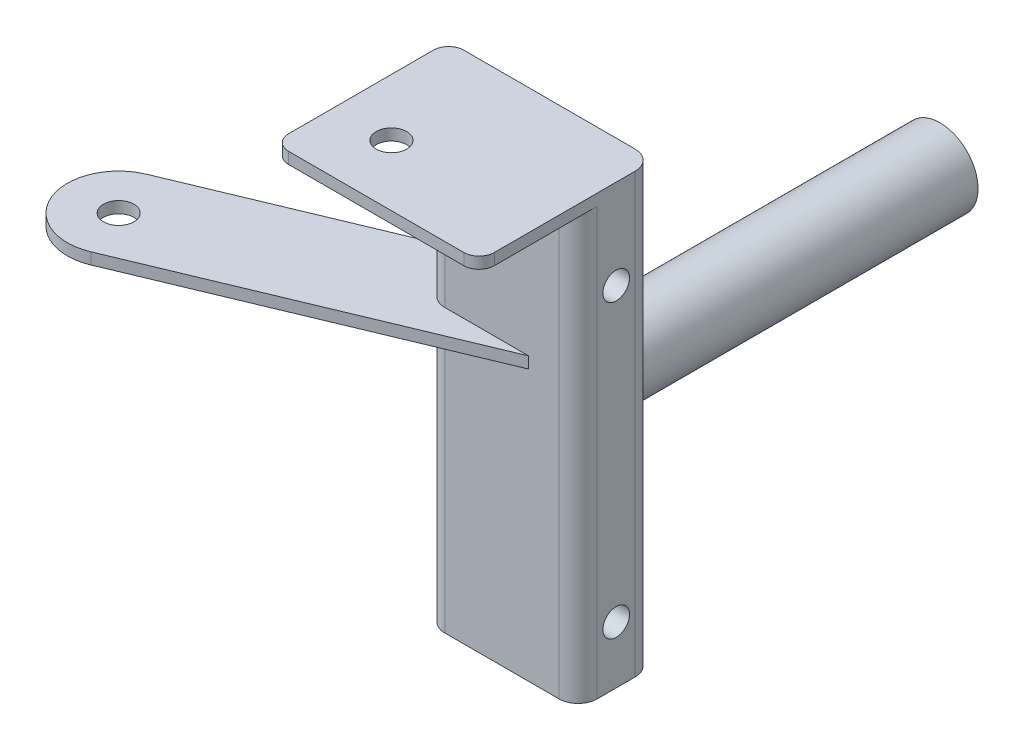
ISO-10303-21;
HEADER;
FILE_DESCRIPTION(('STEP AP214'),'2;1');
FILE_NAME('part.step','',(''),(''),'','','');
FILE_SCHEMA(('AUTOMOTIVE_DESIGN { 1 0 10303 214 1 1 1 1 }'));
ENDSEC;
DATA;
#1=APPLICATION_CONTEXT('core data for automotive mechanical design processes');
#2=APPLICATION_PROTOCOL_DEFINITION('international standard','automotive_design',2000,#1);
#3=PRODUCT_CONTEXT('',#1,'mechanical');
#4=PRODUCT('Part','Part','',(#3));
#5=PRODUCT_RELATED_PRODUCT_CATEGORY('part','',(#4));
#6=PRODUCT_DEFINITION_FORMATION('','',#4);
#7=PRODUCT_DEFINITION_CONTEXT('part definition',#1,'design');
#8=PRODUCT_DEFINITION('design','',#6,#7);
#9=PRODUCT_DEFINITION_SHAPE('','',#8);
#10=(LENGTH_UNIT() NAMED_UNIT(*) SI_UNIT(.MILLI.,.METRE.));
#11=(NAMED_UNIT(*) PLANE_ANGLE_UNIT() SI_UNIT($,.RADIAN.));
#12=(NAMED_UNIT(*) SI_UNIT($,.STERADIAN.) SOLID_ANGLE_UNIT());
#13=UNCERTAINTY_MEASURE_WITH_UNIT(LENGTH_MEASURE(1.E-05),#10,'distance_accuracy_value','');
#14=(GEOMETRIC_REPRESENTATION_CONTEXT(3) GLOBAL_UNCERTAINTY_ASSIGNED_CONTEXT((#13)) GLOBAL_UNIT_ASSIGNED_CONTEXT((#10,
#11,#12)) REPRESENTATION_CONTEXT('',''));
#15=CARTESIAN_POINT('',(0.,0.,0.));
#16=DIRECTION('',(0.,0.,1.));
#17=DIRECTION('',(1.,0.,0.));
#18=AXIS2_PLACEMENT_3D('',#15,#16,#17);
#19=CARTESIAN_POINT('',(-40.,115.,0.));
#20=DIRECTION('',(1.,0.,0.));
#21=DIRECTION('',(0.,0.,1.));
#22=AXIS2_PLACEMENT_3D('',#19,#20,#21);
#23=PLANE('',#22);
#24=DIRECTION('',(0.,0.,-1.));
#25=VECTOR('',#24,1.);
#26=CARTESIAN_POINT('',(-40.,0.,0.));
#27=LINE('',#26,#25);
#28=CARTESIAN_POINT('',(-40.,0.,-5.));
#29=VERTEX_POINT('',#28);
#30=CARTESIAN_POINT('',(-40.,0.,-18.));
#31=VERTEX_POINT('',#30);
#32=EDGE_CURVE('E302',#29,#31,#27,.T.);
#33=ORIENTED_EDGE('',*,*,#32,.F.);
#34=DIRECTION('',(0.,-1.,0.));
#35=VECTOR('',#34,1.);
#36=CARTESIAN_POINT('',(-40.,115.,-5.));
#37=LINE('',#36,#35);
#38=CARTESIAN_POINT('',(-40.,71.,-5.));
#39=VERTEX_POINT('',#38);
#40=EDGE_CURVE('E337',#39,#29,#37,.T.);
#41=ORIENTED_EDGE('',*,*,#40,.F.);
#42=DIRECTION('',(0.,0.,1.));
#43=VECTOR('',#42,1.);
#44=CARTESIAN_POINT('',(-40.,71.,0.));
#45=LINE('',#44,#43);
#46=CARTESIAN_POINT('',(-40.,71.,-18.));
#47=VERTEX_POINT('',#46);
#48=EDGE_CURVE('E498',#47,#39,#45,.T.);
#49=ORIENTED_EDGE('',*,*,#48,.F.);
#50=DIRECTION('',(0.,-1.,0.));
#51=VECTOR('',#50,1.);
#52=CARTESIAN_POINT('',(-40.,115.,-18.));
#53=LINE('',#52,#51);
#54=EDGE_CURVE('E202',#31,#47,#53,.F.);
#55=ORIENTED_EDGE('',*,*,#54,.F.);
#56=EDGE_LOOP('',(#33,#41,#49,#55));
#57=FACE_BOUND('',#56,.T.);
#58=ADVANCED_FACE('F51',(#57),#23,.F.);
#59=CARTESIAN_POINT('',(0.,115.,0.));
#60=DIRECTION('',(0.,0.,-1.));
#61=DIRECTION('',(1.,0.,0.));
#62=AXIS2_PLACEMENT_3D('',#59,#60,#61);
#63=PLANE('',#62);
#64=DIRECTION('',(-1.,0.,0.));
#65=VECTOR('',#64,1.);
#66=CARTESIAN_POINT('',(0.,0.,0.));
#67=LINE('',#66,#65);
#68=CARTESIAN_POINT('',(-5.,0.,0.));
#69=VERTEX_POINT('',#68);
#70=CARTESIAN_POINT('',(-35.,0.,0.));
#71=VERTEX_POINT('',#70);
#72=EDGE_CURVE('E299',#69,#71,#67,.T.);
#73=ORIENTED_EDGE('',*,*,#72,.F.);
#74=DIRECTION('',(0.,-1.,0.));
#75=VECTOR('',#74,1.);
#76=CARTESIAN_POINT('',(-5.,115.,0.));
#77=LINE('',#76,#75);
#78=CARTESIAN_POINT('',(-5.,112.,0.));
#79=VERTEX_POINT('',#78);
#80=EDGE_CURVE('E327',#79,#69,#77,.T.);
#81=ORIENTED_EDGE('',*,*,#80,.F.);
#82=DIRECTION('',(-1.,0.,0.));
#83=VECTOR('',#82,1.);
#84=CARTESIAN_POINT('',(0.,112.,0.));
#85=LINE('',#84,#83);
#86=CARTESIAN_POINT('',(-35.,112.,0.));
#87=VERTEX_POINT('',#86);
#88=EDGE_CURVE('E272',#79,#87,#85,.T.);
#89=ORIENTED_EDGE('',*,*,#88,.T.);
#90=DIRECTION('',(0.,-1.,0.));
#91=VECTOR('',#90,1.);
#92=CARTESIAN_POINT('',(-35.,115.,0.));
#93=LINE('',#92,#91);
#94=CARTESIAN_POINT('',(-35.,74.,0.));
#95=VERTEX_POINT('',#94);
#96=EDGE_CURVE('E321',#95,#87,#93,.F.);
#97=ORIENTED_EDGE('',*,*,#96,.F.);
#98=DIRECTION('',(1.,0.,0.));
#99=VECTOR('',#98,1.);
#100=CARTESIAN_POINT('',(0.,74.,0.));
#101=LINE('',#100,#99);
#102=CARTESIAN_POINT('',(-13.,74.,0.));
#103=VERTEX_POINT('',#102);
#104=EDGE_CURVE('E233',#95,#103,#101,.T.);
#105=ORIENTED_EDGE('',*,*,#104,.T.);
#106=DIRECTION('',(0.,1.,0.));
#107=VECTOR('',#106,1.);
#108=CARTESIAN_POINT('',(-13.,71.,0.));
#109=LINE('',#108,#107);
#110=CARTESIAN_POINT('',(-13.,71.,0.));
#111=VERTEX_POINT('',#110);
#112=EDGE_CURVE('E207',#111,#103,#109,.T.);
#113=ORIENTED_EDGE('',*,*,#112,.F.);
#114=DIRECTION('',(1.,0.,0.));
#115=VECTOR('',#114,1.);
#116=CARTESIAN_POINT('',(0.,71.,0.));
#117=LINE('',#116,#115);
#118=CARTESIAN_POINT('',(-35.,71.,0.));
#119=VERTEX_POINT('',#118);
#120=EDGE_CURVE('E501',#119,#111,#117,.T.);
#121=ORIENTED_EDGE('',*,*,#120,.F.);
#122=DIRECTION('',(0.,-1.,0.));
#123=VECTOR('',#122,1.);
#124=CARTESIAN_POINT('',(-35.,115.,0.));
#125=LINE('',#124,#123);
#126=EDGE_CURVE('E342',#71,#119,#125,.F.);
#127=ORIENTED_EDGE('',*,*,#126,.F.);
#128=EDGE_LOOP('',(#73,#81,#89,#97,#105,#113,#121,#127));
#129=FACE_BOUND('',#128,.T.);
#130=ADVANCED_FACE('F436',(#129),#63,.F.);
#131=DIRECTION('',(0.,0.,1.));
#132=VECTOR('',#131,1.);
#133=CARTESIAN_POINT('',(-40.,74.,0.));
#134=LINE('',#133,#132);
#135=CARTESIAN_POINT('',(-40.,74.,-18.));
#136=VERTEX_POINT('',#135);
#137=CARTESIAN_POINT('',(-40.,74.,-5.));
#138=VERTEX_POINT('',#137);
#139=EDGE_CURVE('E219',#136,#138,#134,.T.);
#140=ORIENTED_EDGE('',*,*,#139,.T.);
#141=DIRECTION('',(0.,-1.,0.));
#142=VECTOR('',#141,1.);
#143=CARTESIAN_POINT('',(-40.,115.,-5.));
#144=LINE('',#143,#142);
#145=CARTESIAN_POINT('',(-40.,112.,-5.));
#146=VERTEX_POINT('',#145);
#147=EDGE_CURVE('E319',#146,#138,#144,.T.);
#148=ORIENTED_EDGE('',*,*,#147,.F.);
#149=DIRECTION('',(0.,0.,-1.));
#150=VECTOR('',#149,1.);
#151=CARTESIAN_POINT('',(-40.,112.,0.));
#152=LINE('',#151,#150);
#153=CARTESIAN_POINT('',(-40.,112.,-18.));
#154=VERTEX_POINT('',#153);
#155=EDGE_CURVE('E226',#146,#154,#152,.T.);
#156=ORIENTED_EDGE('',*,*,#155,.T.);
#157=DIRECTION('',(0.,-1.,0.));
#158=VECTOR('',#157,1.);
#159=CARTESIAN_POINT('',(-40.,115.,-18.));
#160=LINE('',#159,#158);
#161=EDGE_CURVE('E199',#136,#154,#160,.F.);
#162=ORIENTED_EDGE('',*,*,#161,.F.);
#163=EDGE_LOOP('',(#140,#148,#156,#162));
#164=FACE_BOUND('',#163,.T.);
#165=ADVANCED_FACE('F223',(#164),#23,.F.);
#166=CARTESIAN_POINT('',(0.,115.,0.));
#167=DIRECTION('',(-1.,0.,0.));
#168=DIRECTION('',(0.,0.,-1.));
#169=AXIS2_PLACEMENT_3D('',#166,#167,#168);
#170=PLANE('',#169);
#171=CARTESIAN_POINT('',(0.,91.5,-10.));
#172=DIRECTION('',(-1.,0.,0.));
#173=DIRECTION('',(0.,0.,1.));
#174=AXIS2_PLACEMENT_3D('',#171,#172,#173);
#175=CIRCLE('',#174,3.5);
#176=CARTESIAN_POINT('',(0.,91.5,-6.50000000000001));
#177=VERTEX_POINT('',#176);
#178=EDGE_CURVE('E749',#177,#177,#175,.T.);
#179=ORIENTED_EDGE('',*,*,#178,.T.);
#180=EDGE_LOOP('',(#179));
#181=FACE_BOUND('',#180,.T.);
#182=CARTESIAN_POINT('',(0.,15.,-10.));
#183=DIRECTION('',(-1.,0.,0.));
#184=DIRECTION('',(0.,0.,1.));
#185=AXIS2_PLACEMENT_3D('',#182,#183,#184);
#186=CIRCLE('',#185,3.5);
#187=CARTESIAN_POINT('',(0.,15.,-6.5));
#188=VERTEX_POINT('',#187);
#189=EDGE_CURVE('E756',#188,#188,#186,.T.);
#190=ORIENTED_EDGE('',*,*,#189,.T.);
#191=EDGE_LOOP('',(#190));
#192=FACE_BOUND('',#191,.T.);
#193=DIRECTION('',(0.,0.,1.));
#194=VECTOR('',#193,1.);
#195=CARTESIAN_POINT('',(0.,112.,0.));
#196=LINE('',#195,#194);
#197=CARTESIAN_POINT('',(0.,112.,-5.));
#198=VERTEX_POINT('',#197);
#199=CARTESIAN_POINT('',(0.,112.,22.));
#200=VERTEX_POINT('',#199);
#201=EDGE_CURVE('E275',#198,#200,#196,.T.);
#202=ORIENTED_EDGE('',*,*,#201,.F.);
#203=DIRECTION('',(0.,-1.,0.));
#204=VECTOR('',#203,1.);
#205=CARTESIAN_POINT('',(0.,115.,-5.));
#206=LINE('',#205,#204);
#207=CARTESIAN_POINT('',(0.,0.,-5.));
#208=VERTEX_POINT('',#207);
#209=EDGE_CURVE('E332',#208,#198,#206,.F.);
#210=ORIENTED_EDGE('',*,*,#209,.F.);
#211=DIRECTION('',(0.,0.,1.));
#212=VECTOR('',#211,1.);
#213=CARTESIAN_POINT('',(0.,0.,0.));
#214=LINE('',#213,#212);
#215=CARTESIAN_POINT('',(0.,0.,-15.));
#216=VERTEX_POINT('',#215);
#217=EDGE_CURVE('E281',#216,#208,#214,.T.);
#218=ORIENTED_EDGE('',*,*,#217,.F.);
#219=DIRECTION('',(0.,-1.,0.));
#220=VECTOR('',#219,1.);
#221=CARTESIAN_POINT('',(0.,115.,-15.));
#222=LINE('',#221,#220);
#223=CARTESIAN_POINT('',(0.,115.,-15.));
#224=VERTEX_POINT('',#223);
#225=EDGE_CURVE('E309',#224,#216,#222,.T.);
#226=ORIENTED_EDGE('',*,*,#225,.F.);
#227=DIRECTION('',(0.,0.,1.));
#228=VECTOR('',#227,1.);
#229=CARTESIAN_POINT('',(0.,115.,0.));
#230=LINE('',#229,#228);
#231=CARTESIAN_POINT('',(0.,115.,22.));
#232=VERTEX_POINT('',#231);
#233=EDGE_CURVE('E289',#224,#232,#230,.T.);
#234=ORIENTED_EDGE('',*,*,#233,.T.);
#235=DIRECTION('',(0.,1.,0.));
#236=VECTOR('',#235,1.);
#237=CARTESIAN_POINT('',(0.,115.,22.));
#238=LINE('',#237,#236);
#239=EDGE_CURVE('E11',#200,#232,#238,.T.);
#240=ORIENTED_EDGE('',*,*,#239,.F.);
#241=EDGE_LOOP('',(#202,#210,#218,#226,#234,#240));
#242=FACE_BOUND('',#241,.T.);
#243=ADVANCED_FACE('F415',(#181,#192,#242),#170,.F.);
#244=CARTESIAN_POINT('',(0.,115.,-20.));
#245=DIRECTION('',(0.,0.,1.));
#246=DIRECTION('',(-1.,0.,0.));
#247=AXIS2_PLACEMENT_3D('',#244,#245,#246);
#248=PLANE('',#247);
#249=CARTESIAN_POINT('',(-20.,56.,-20.));
#250=DIRECTION('',(0.,0.,-1.));
#251=DIRECTION('',(-1.,0.,0.));
#252=AXIS2_PLACEMENT_3D('',#249,#250,#251);
#253=CIRCLE('',#252,10.);
#254=CARTESIAN_POINT('',(-30.,56.,-20.));
#255=VERTEX_POINT('',#254);
#256=EDGE_CURVE('E254',#255,#255,#253,.T.);
#257=ORIENTED_EDGE('',*,*,#256,.F.);
#258=EDGE_LOOP('',(#257));
#259=FACE_BOUND('',#258,.T.);
#260=DIRECTION('',(1.,0.,0.));
#261=VECTOR('',#260,1.);
#262=CARTESIAN_POINT('',(0.,115.,-20.));
#263=LINE('',#262,#261);
#264=CARTESIAN_POINT('',(-50.,115.,-20.));
#265=VERTEX_POINT('',#264);
#266=CARTESIAN_POINT('',(-5.,115.,-20.));
#267=VERTEX_POINT('',#266);
#268=EDGE_CURVE('E292',#265,#267,#263,.T.);
#269=ORIENTED_EDGE('',*,*,#268,.T.);
#270=DIRECTION('',(0.,-1.,0.));
#271=VECTOR('',#270,1.);
#272=CARTESIAN_POINT('',(-5.,115.,-20.));
#273=LINE('',#272,#271);
#274=CARTESIAN_POINT('',(-5.,0.,-20.));
#275=VERTEX_POINT('',#274);
#276=EDGE_CURVE('E314',#275,#267,#273,.F.);
#277=ORIENTED_EDGE('',*,*,#276,.F.);
#278=DIRECTION('',(1.,0.,0.));
#279=VECTOR('',#278,1.);
#280=CARTESIAN_POINT('',(0.,0.,-20.));
#281=LINE('',#280,#279);
#282=CARTESIAN_POINT('',(-38.,0.,-20.));
#283=VERTEX_POINT('',#282);
#284=EDGE_CURVE('E293',#283,#275,#281,.T.);
#285=ORIENTED_EDGE('',*,*,#284,.F.);
#286=DIRECTION('',(0.,-1.,0.));
#287=VECTOR('',#286,1.);
#288=CARTESIAN_POINT('',(-38.,115.,-20.));
#289=LINE('',#288,#287);
#290=CARTESIAN_POINT('',(-38.,112.,-20.));
#291=VERTEX_POINT('',#290);
#292=EDGE_CURVE('E361',#291,#283,#289,.T.);
#293=ORIENTED_EDGE('',*,*,#292,.F.);
#294=DIRECTION('',(-1.,0.,0.));
#295=VECTOR('',#294,1.);
#296=CARTESIAN_POINT('',(0.,112.,-20.));
#297=LINE('',#296,#295);
#298=CARTESIAN_POINT('',(-50.,112.,-20.));
#299=VERTEX_POINT('',#298);
#300=EDGE_CURVE('E268',#291,#299,#297,.T.);
#301=ORIENTED_EDGE('',*,*,#300,.T.);
#302=DIRECTION('',(0.,1.,0.));
#303=VECTOR('',#302,1.);
#304=CARTESIAN_POINT('',(-50.,115.,-20.));
#305=LINE('',#304,#303);
#306=EDGE_CURVE('E383',#265,#299,#305,.F.);
#307=ORIENTED_EDGE('',*,*,#306,.F.);
#308=EDGE_LOOP('',(#269,#277,#285,#293,#301,#307));
#309=FACE_BOUND('',#308,.T.);
#310=ADVANCED_FACE('F423',(#259,#309),#248,.F.);
#311=CARTESIAN_POINT('',(0.,115.,0.));
#312=DIRECTION('',(0.,-1.,0.));
#313=DIRECTION('',(0.,0.,-1.));
#314=AXIS2_PLACEMENT_3D('',#311,#312,#313);
#315=PLANE('',#314);
#316=DIRECTION('',(0.,0.,1.));
#317=VECTOR('',#316,1.);
#318=CARTESIAN_POINT('',(-54.,115.,0.));
#319=LINE('',#318,#317);
#320=CARTESIAN_POINT('',(-54.,115.,-16.));
#321=VERTEX_POINT('',#320);
#322=CARTESIAN_POINT('',(-54.,115.,22.));
#323=VERTEX_POINT('',#322);
#324=EDGE_CURVE('E284',#321,#323,#319,.T.);
#325=ORIENTED_EDGE('',*,*,#324,.T.);
#326=CARTESIAN_POINT('',(-50.,115.,22.));
#327=DIRECTION('',(0.,1.,0.));
#328=DIRECTION('',(0.,0.,-1.));
#329=AXIS2_PLACEMENT_3D('',#326,#327,#328);
#330=CIRCLE('',#329,4.);
#331=CARTESIAN_POINT('',(-50.,115.,26.));
#332=VERTEX_POINT('',#331);
#333=EDGE_CURVE('E378',#332,#323,#330,.F.);
#334=ORIENTED_EDGE('',*,*,#333,.F.);
#335=DIRECTION('',(-1.,0.,0.));
#336=VECTOR('',#335,1.);
#337=CARTESIAN_POINT('',(0.,115.,26.));
#338=LINE('',#337,#336);
#339=CARTESIAN_POINT('',(-4.,115.,26.));
#340=VERTEX_POINT('',#339);
#341=EDGE_CURVE('E265',#340,#332,#338,.T.);
#342=ORIENTED_EDGE('',*,*,#341,.F.);
#343=CARTESIAN_POINT('',(-4.,115.,22.));
#344=DIRECTION('',(0.,1.,0.));
#345=DIRECTION('',(0.,0.,-1.));
#346=AXIS2_PLACEMENT_3D('',#343,#344,#345);
#347=CIRCLE('',#346,4.);
#348=EDGE_CURVE('E375',#232,#340,#347,.F.);
#349=ORIENTED_EDGE('',*,*,#348,.F.);
#350=ORIENTED_EDGE('',*,*,#233,.F.);
#351=CARTESIAN_POINT('',(-5.,115.,-15.));
#352=DIRECTION('',(0.,1.,0.));
#353=DIRECTION('',(0.,0.,-1.));
#354=AXIS2_PLACEMENT_3D('',#351,#352,#353);
#355=CIRCLE('',#354,5.);
#356=EDGE_CURVE('E317',#267,#224,#355,.F.);
#357=ORIENTED_EDGE('',*,*,#356,.F.);
#358=ORIENTED_EDGE('',*,*,#268,.F.);
#359=CARTESIAN_POINT('',(-50.,115.,-16.));
#360=DIRECTION('',(0.,1.,0.));
#361=DIRECTION('',(0.,0.,-1.));
#362=AXIS2_PLACEMENT_3D('',#359,#360,#361);
#363=CIRCLE('',#362,4.);
#364=EDGE_CURVE('E381',#321,#265,#363,.F.);
#365=ORIENTED_EDGE('',*,*,#364,.F.);
#366=EDGE_LOOP('',(#325,#334,#342,#349,#350,#357,#358,#365));
#367=FACE_BOUND('',#366,.T.);
#368=CARTESIAN_POINT('',(-39.,115.,10.));
#369=DIRECTION('',(0.,-1.,0.));
#370=DIRECTION('',(0.,0.,1.));
#371=AXIS2_PLACEMENT_3D('',#368,#369,#370);
#372=CIRCLE('',#371,4.00000000000001);
#373=CARTESIAN_POINT('',(-39.,115.,14.));
#374=VERTEX_POINT('',#373);
#375=EDGE_CURVE('E258',#374,#374,#372,.T.);
#376=ORIENTED_EDGE('',*,*,#375,.T.);
#377=EDGE_LOOP('',(#376));
#378=FACE_BOUND('',#377,.T.);
#379=ADVANCED_FACE('F398',(#367,#378),#315,.F.);
#380=CARTESIAN_POINT('',(0.,0.,0.));
#381=DIRECTION('',(0.,-1.,0.));
#382=DIRECTION('',(0.,0.,-1.));
#383=AXIS2_PLACEMENT_3D('',#380,#381,#382);
#384=PLANE('',#383);
#385=CARTESIAN_POINT('',(-20.,0.,-10.));
#386=DIRECTION('',(0.,1.,0.));
#387=DIRECTION('',(0.,0.,-1.));
#388=AXIS2_PLACEMENT_3D('',#385,#386,#387);
#389=CIRCLE('',#388,4.);
#390=CARTESIAN_POINT('',(-20.,0.,-14.));
#391=VERTEX_POINT('',#390);
#392=EDGE_CURVE('E206',#391,#391,#389,.T.);
#393=ORIENTED_EDGE('',*,*,#392,.T.);
#394=EDGE_LOOP('',(#393));
#395=FACE_BOUND('',#394,.T.);
#396=ORIENTED_EDGE('',*,*,#284,.T.);
#397=CARTESIAN_POINT('',(-5.,0.,-15.));
#398=DIRECTION('',(0.,1.,0.));
#399=DIRECTION('',(0.,0.,-1.));
#400=AXIS2_PLACEMENT_3D('',#397,#398,#399);
#401=CIRCLE('',#400,5.);
#402=EDGE_CURVE('E312',#216,#275,#401,.T.);
#403=ORIENTED_EDGE('',*,*,#402,.F.);
#404=ORIENTED_EDGE('',*,*,#217,.T.);
#405=CARTESIAN_POINT('',(-5.,0.,-5.));
#406=DIRECTION('',(0.,1.,0.));
#407=DIRECTION('',(0.,0.,-1.));
#408=AXIS2_PLACEMENT_3D('',#405,#406,#407);
#409=CIRCLE('',#408,5.);
#410=EDGE_CURVE('E330',#69,#208,#409,.T.);
#411=ORIENTED_EDGE('',*,*,#410,.F.);
#412=ORIENTED_EDGE('',*,*,#72,.T.);
#413=CARTESIAN_POINT('',(-35.,0.,-5.));
#414=DIRECTION('',(0.,1.,0.));
#415=DIRECTION('',(0.,0.,-1.));
#416=AXIS2_PLACEMENT_3D('',#413,#414,#415);
#417=CIRCLE('',#416,5.);
#418=EDGE_CURVE('E340',#29,#71,#417,.T.);
#419=ORIENTED_EDGE('',*,*,#418,.F.);
#420=ORIENTED_EDGE('',*,*,#32,.T.);
#421=CARTESIAN_POINT('',(-38.,0.,-18.));
#422=DIRECTION('',(0.,1.,0.));
#423=DIRECTION('',(0.,0.,-1.));
#424=AXIS2_PLACEMENT_3D('',#421,#422,#423);
#425=CIRCLE('',#424,2.);
#426=EDGE_CURVE('E227',#283,#31,#425,.T.);
#427=ORIENTED_EDGE('',*,*,#426,.F.);
#428=EDGE_LOOP('',(#396,#403,#404,#411,#412,#419,#420,#427));
#429=FACE_BOUND('',#428,.T.);
#430=ADVANCED_FACE('F495',(#395,#429),#384,.T.);
#431=CARTESIAN_POINT('',(-54.,112.,0.));
#432=DIRECTION('',(1.,0.,0.));
#433=DIRECTION('',(0.,0.,1.));
#434=AXIS2_PLACEMENT_3D('',#431,#432,#433);
#435=PLANE('',#434);
#436=DIRECTION('',(0.,0.,1.));
#437=VECTOR('',#436,1.);
#438=CARTESIAN_POINT('',(-54.,112.,0.));
#439=LINE('',#438,#437);
#440=CARTESIAN_POINT('',(-54.,112.,-16.));
#441=VERTEX_POINT('',#440);
#442=CARTESIAN_POINT('',(-54.,112.,22.));
#443=VERTEX_POINT('',#442);
#444=EDGE_CURVE('E264',#441,#443,#439,.T.);
#445=ORIENTED_EDGE('',*,*,#444,.T.);
#446=DIRECTION('',(0.,1.,0.));
#447=VECTOR('',#446,1.);
#448=CARTESIAN_POINT('',(-54.,112.,22.));
#449=LINE('',#448,#447);
#450=EDGE_CURVE('E371',#323,#443,#449,.F.);
#451=ORIENTED_EDGE('',*,*,#450,.F.);
#452=ORIENTED_EDGE('',*,*,#324,.F.);
#453=DIRECTION('',(0.,1.,0.));
#454=VECTOR('',#453,1.);
#455=CARTESIAN_POINT('',(-54.,112.,-16.));
#456=LINE('',#455,#454);
#457=EDGE_CURVE('E373',#441,#321,#456,.T.);
#458=ORIENTED_EDGE('',*,*,#457,.F.);
#459=EDGE_LOOP('',(#445,#451,#452,#458));
#460=FACE_BOUND('',#459,.T.);
#461=ADVANCED_FACE('F405',(#460),#435,.F.);
#462=CARTESIAN_POINT('',(0.,112.,26.));
#463=DIRECTION('',(0.,0.,1.));
#464=DIRECTION('',(-1.,0.,0.));
#465=AXIS2_PLACEMENT_3D('',#462,#463,#464);
#466=PLANE('',#465);
#467=DIRECTION('',(-1.,0.,0.));
#468=VECTOR('',#467,1.);
#469=CARTESIAN_POINT('',(0.,112.,26.));
#470=LINE('',#469,#468);
#471=CARTESIAN_POINT('',(-4.,112.,26.));
#472=VERTEX_POINT('',#471);
#473=CARTESIAN_POINT('',(-50.,112.,26.));
#474=VERTEX_POINT('',#473);
#475=EDGE_CURVE('E278',#472,#474,#470,.T.);
#476=ORIENTED_EDGE('',*,*,#475,.F.);
#477=DIRECTION('',(0.,1.,0.));
#478=VECTOR('',#477,1.);
#479=CARTESIAN_POINT('',(-4.,112.,26.));
#480=LINE('',#479,#478);
#481=EDGE_CURVE('E390',#340,#472,#480,.F.);
#482=ORIENTED_EDGE('',*,*,#481,.F.);
#483=ORIENTED_EDGE('',*,*,#341,.T.);
#484=DIRECTION('',(0.,1.,0.));
#485=VECTOR('',#484,1.);
#486=CARTESIAN_POINT('',(-50.,115.,26.));
#487=LINE('',#486,#485);
#488=EDGE_CURVE('E59',#474,#332,#487,.T.);
#489=ORIENTED_EDGE('',*,*,#488,.F.);
#490=EDGE_LOOP('',(#476,#482,#483,#489));
#491=FACE_BOUND('',#490,.T.);
#492=ADVANCED_FACE('F396',(#491),#466,.T.);
#493=CARTESIAN_POINT('',(-39.,112.,10.));
#494=DIRECTION('',(0.,1.,0.));
#495=DIRECTION('',(0.,0.,1.));
#496=AXIS2_PLACEMENT_3D('',#493,#494,#495);
#497=CYLINDRICAL_SURFACE('',#496,4.00000000000001);
#498=CARTESIAN_POINT('',(-39.,112.,10.));
#499=DIRECTION('',(0.,-1.,0.));
#500=DIRECTION('',(0.,0.,1.));
#501=AXIS2_PLACEMENT_3D('',#498,#499,#500);
#502=CIRCLE('',#501,4.00000000000001);
#503=CARTESIAN_POINT('',(-39.,112.,14.));
#504=VERTEX_POINT('',#503);
#505=EDGE_CURVE('E261',#504,#504,#502,.T.);
#506=ORIENTED_EDGE('',*,*,#505,.T.);
#507=EDGE_LOOP('',(#506));
#508=FACE_BOUND('',#507,.T.);
#509=ORIENTED_EDGE('',*,*,#375,.F.);
#510=EDGE_LOOP('',(#509));
#511=FACE_BOUND('',#510,.T.);
#512=ADVANCED_FACE('F551',(#508,#511),#497,.F.);
#513=CARTESIAN_POINT('',(0.,112.,0.));
#514=DIRECTION('',(0.,1.,0.));
#515=DIRECTION('',(0.,0.,1.));
#516=AXIS2_PLACEMENT_3D('',#513,#514,#515);
#517=PLANE('',#516);
#518=ORIENTED_EDGE('',*,*,#505,.F.);
#519=EDGE_LOOP('',(#518));
#520=FACE_BOUND('',#519,.T.);
#521=ORIENTED_EDGE('',*,*,#300,.F.);
#522=CARTESIAN_POINT('',(-38.,112.,-18.));
#523=DIRECTION('',(0.,-1.,0.));
#524=DIRECTION('',(0.,0.,1.));
#525=AXIS2_PLACEMENT_3D('',#522,#523,#524);
#526=CIRCLE('',#525,2.);
#527=EDGE_CURVE('E369',#154,#291,#526,.T.);
#528=ORIENTED_EDGE('',*,*,#527,.F.);
#529=ORIENTED_EDGE('',*,*,#155,.F.);
#530=CARTESIAN_POINT('',(-35.,112.,-5.));
#531=DIRECTION('',(0.,-1.,0.));
#532=DIRECTION('',(0.,0.,1.));
#533=AXIS2_PLACEMENT_3D('',#530,#531,#532);
#534=CIRCLE('',#533,5.);
#535=EDGE_CURVE('E325',#87,#146,#534,.T.);
#536=ORIENTED_EDGE('',*,*,#535,.F.);
#537=ORIENTED_EDGE('',*,*,#88,.F.);
#538=CARTESIAN_POINT('',(-5.,112.,-5.));
#539=DIRECTION('',(0.,-1.,0.));
#540=DIRECTION('',(0.,0.,1.));
#541=AXIS2_PLACEMENT_3D('',#538,#539,#540);
#542=CIRCLE('',#541,5.);
#543=EDGE_CURVE('E335',#198,#79,#542,.T.);
#544=ORIENTED_EDGE('',*,*,#543,.F.);
#545=ORIENTED_EDGE('',*,*,#201,.T.);
#546=CARTESIAN_POINT('',(-4.,112.,22.));
#547=DIRECTION('',(0.,-1.,0.));
#548=DIRECTION('',(0.,0.,1.));
#549=AXIS2_PLACEMENT_3D('',#546,#547,#548);
#550=CIRCLE('',#549,4.);
#551=EDGE_CURVE('E65',#472,#200,#550,.F.);
#552=ORIENTED_EDGE('',*,*,#551,.F.);
#553=ORIENTED_EDGE('',*,*,#475,.T.);
#554=CARTESIAN_POINT('',(-50.,112.,22.));
#555=DIRECTION('',(0.,-1.,0.));
#556=DIRECTION('',(0.,0.,1.));
#557=AXIS2_PLACEMENT_3D('',#554,#555,#556);
#558=CIRCLE('',#557,4.);
#559=EDGE_CURVE('E73',#443,#474,#558,.F.);
#560=ORIENTED_EDGE('',*,*,#559,.F.);
#561=ORIENTED_EDGE('',*,*,#444,.F.);
#562=CARTESIAN_POINT('',(-50.,112.,-16.));
#563=DIRECTION('',(0.,-1.,0.));
#564=DIRECTION('',(0.,0.,1.));
#565=AXIS2_PLACEMENT_3D('',#562,#563,#564);
#566=CIRCLE('',#565,4.);
#567=EDGE_CURVE('E388',#299,#441,#566,.F.);
#568=ORIENTED_EDGE('',*,*,#567,.F.);
#569=EDGE_LOOP('',(#521,#528,#529,#536,#537,#544,#545,#552,#553,#560,#561,#568));
#570=FACE_BOUND('',#569,.T.);
#571=ADVANCED_FACE('F409',(#520,#570),#517,.F.);
#572=CARTESIAN_POINT('',(-20.,56.,-115.));
#573=DIRECTION('',(0.,0.,1.));
#574=DIRECTION('',(-1.,0.,0.));
#575=AXIS2_PLACEMENT_3D('',#572,#573,#574);
#576=CYLINDRICAL_SURFACE('',#575,10.);
#577=CARTESIAN_POINT('',(-20.,56.,-115.));
#578=DIRECTION('',(0.,0.,-1.));
#579=DIRECTION('',(-1.,0.,0.));
#580=AXIS2_PLACEMENT_3D('',#577,#578,#579);
#581=CIRCLE('',#580,10.);
#582=CARTESIAN_POINT('',(-30.,56.,-115.));
#583=VERTEX_POINT('',#582);
#584=EDGE_CURVE('E255',#583,#583,#581,.T.);
#585=ORIENTED_EDGE('',*,*,#584,.F.);
#586=EDGE_LOOP('',(#585));
#587=FACE_BOUND('',#586,.T.);
#588=ORIENTED_EDGE('',*,*,#256,.T.);
#589=EDGE_LOOP('',(#588));
#590=FACE_BOUND('',#589,.T.);
#591=ADVANCED_FACE('F544',(#587,#590),#576,.T.);
#592=CARTESIAN_POINT('',(-20.,56.,-115.));
#593=DIRECTION('',(0.,0.,1.));
#594=DIRECTION('',(-1.,0.,0.));
#595=AXIS2_PLACEMENT_3D('',#592,#593,#594);
#596=PLANE('',#595);
#597=CARTESIAN_POINT('',(-20.,56.,-115.));
#598=DIRECTION('',(0.,0.,-1.));
#599=DIRECTION('',(-1.,0.,0.));
#600=AXIS2_PLACEMENT_3D('',#597,#598,#599);
#601=CIRCLE('',#600,4.);
#602=CARTESIAN_POINT('',(-24.,56.,-115.));
#603=VERTEX_POINT('',#602);
#604=EDGE_CURVE('E249',#603,#603,#601,.T.);
#605=ORIENTED_EDGE('',*,*,#604,.F.);
#606=EDGE_LOOP('',(#605));
#607=FACE_BOUND('',#606,.T.);
#608=ORIENTED_EDGE('',*,*,#584,.T.);
#609=EDGE_LOOP('',(#608));
#610=FACE_BOUND('',#609,.T.);
#611=ADVANCED_FACE('F540',(#607,#610),#596,.F.);
#612=CARTESIAN_POINT('',(-20.,56.,-115.));
#613=DIRECTION('',(0.,0.,1.));
#614=DIRECTION('',(-1.,0.,0.));
#615=AXIS2_PLACEMENT_3D('',#612,#613,#614);
#616=CYLINDRICAL_SURFACE('',#615,4.);
#617=ORIENTED_EDGE('',*,*,#604,.T.);
#618=EDGE_LOOP('',(#617));
#619=FACE_BOUND('',#618,.T.);
#620=CARTESIAN_POINT('',(-20.,56.,-20.));
#621=DIRECTION('',(0.,0.,-1.));
#622=DIRECTION('',(-1.,0.,0.));
#623=AXIS2_PLACEMENT_3D('',#620,#621,#622);
#624=CIRCLE('',#623,4.);
#625=CARTESIAN_POINT('',(-24.,56.,-20.));
#626=VERTEX_POINT('',#625);
#627=EDGE_CURVE('E296',#626,#626,#624,.T.);
#628=ORIENTED_EDGE('',*,*,#627,.F.);
#629=EDGE_LOOP('',(#628));
#630=FACE_BOUND('',#629,.T.);
#631=ADVANCED_FACE('F537',(#619,#630),#616,.F.);
#632=ORIENTED_EDGE('',*,*,#627,.T.);
#633=EDGE_LOOP('',(#632));
#634=FACE_BOUND('',#633,.T.);
#635=ADVANCED_FACE('F456',(#634),#248,.F.);
#636=CARTESIAN_POINT('',(-20.,18.,-10.));
#637=DIRECTION('',(0.,-1.,0.));
#638=DIRECTION('',(0.,0.,-1.));
#639=AXIS2_PLACEMENT_3D('',#636,#637,#638);
#640=CYLINDRICAL_SURFACE('',#639,4.);
#641=CARTESIAN_POINT('',(-20.,18.,-10.));
#642=DIRECTION('',(0.,1.,0.));
#643=DIRECTION('',(0.,0.,-1.));
#644=AXIS2_PLACEMENT_3D('',#641,#642,#643);
#645=CIRCLE('',#644,4.);
#646=CARTESIAN_POINT('',(-20.,18.,-14.));
#647=VERTEX_POINT('',#646);
#648=EDGE_CURVE('E246',#647,#647,#645,.T.);
#649=ORIENTED_EDGE('',*,*,#648,.T.);
#650=EDGE_LOOP('',(#649));
#651=FACE_BOUND('',#650,.T.);
#652=ORIENTED_EDGE('',*,*,#392,.F.);
#653=EDGE_LOOP('',(#652));
#654=FACE_BOUND('',#653,.T.);
#655=ADVANCED_FACE('F532',(#651,#654),#640,.F.);
#656=CARTESIAN_POINT('',(-20.,18.,-10.));
#657=DIRECTION('',(0.,-1.,0.));
#658=DIRECTION('',(0.,0.,-1.));
#659=AXIS2_PLACEMENT_3D('',#656,#657,#658);
#660=PLANE('',#659);
#661=ORIENTED_EDGE('',*,*,#648,.F.);
#662=EDGE_LOOP('',(#661));
#663=FACE_BOUND('',#662,.T.);
#664=ADVANCED_FACE('F526',(#663),#660,.T.);
#665=CARTESIAN_POINT('',(-12.3076923076923,71.,-29.5384615384615));
#666=DIRECTION('',(-0.384615384615385,0.,-0.923076923076923));
#667=DIRECTION('',(0.923076923076923,0.,-0.384615384615385));
#668=AXIS2_PLACEMENT_3D('',#665,#666,#667);
#669=PLANE('',#668);
#670=DIRECTION('',(0.923076923076923,0.,-0.384615384615385));
#671=VECTOR('',#670,1.);
#672=CARTESIAN_POINT('',(-12.3076923076923,74.,-29.5384615384615));
#673=LINE('',#672,#671);
#674=CARTESIAN_POINT('',(-104.473231723907,74.,8.86384655162785));
#675=VERTEX_POINT('',#674);
#676=EDGE_CURVE('E211',#675,#136,#673,.T.);
#677=ORIENTED_EDGE('',*,*,#676,.T.);
#678=DIRECTION('',(0.,1.,0.));
#679=VECTOR('',#678,1.);
#680=CARTESIAN_POINT('',(-40.,71.,-18.));
#681=LINE('',#680,#679);
#682=EDGE_CURVE('E195',#47,#136,#681,.T.);
#683=ORIENTED_EDGE('',*,*,#682,.F.);
#684=DIRECTION('',(0.923076923076923,0.,-0.384615384615385));
#685=VECTOR('',#684,1.);
#686=CARTESIAN_POINT('',(-12.3076923076923,71.,-29.5384615384615));
#687=LINE('',#686,#685);
#688=CARTESIAN_POINT('',(-104.473231723907,71.,8.86384655162785));
#689=VERTEX_POINT('',#688);
#690=EDGE_CURVE('E500',#689,#47,#687,.T.);
#691=ORIENTED_EDGE('',*,*,#690,.F.);
#692=DIRECTION('',(0.,1.,0.));
#693=VECTOR('',#692,1.);
#694=CARTESIAN_POINT('',(-104.473231723907,71.,8.86384655162784));
#695=LINE('',#694,#693);
#696=EDGE_CURVE('E214',#675,#689,#695,.F.);
#697=ORIENTED_EDGE('',*,*,#696,.F.);
#698=EDGE_LOOP('',(#677,#683,#691,#697));
#699=FACE_BOUND('',#698,.T.);
#700=ADVANCED_FACE('F212',(#699),#669,.T.);
#701=CARTESIAN_POINT('',(-99.2809240315991,71.,21.3253850131663));
#702=DIRECTION('',(0.,1.,0.));
#703=DIRECTION('',(0.,0.,1.));
#704=AXIS2_PLACEMENT_3D('',#701,#702,#703);
#705=CYLINDRICAL_SURFACE('',#704,3.99999999999999);
#706=CARTESIAN_POINT('',(-99.2809240315991,71.,21.3253850131663));
#707=DIRECTION('',(0.,1.,0.));
#708=DIRECTION('',(0.,0.,-1.));
#709=AXIS2_PLACEMENT_3D('',#706,#707,#708);
#710=CIRCLE('',#709,3.99999999999999);
#711=CARTESIAN_POINT('',(-99.2809240315991,71.,17.3253850131663));
#712=VERTEX_POINT('',#711);
#713=EDGE_CURVE('E242',#712,#712,#710,.T.);
#714=ORIENTED_EDGE('',*,*,#713,.F.);
#715=EDGE_LOOP('',(#714));
#716=FACE_BOUND('',#715,.T.);
#717=CARTESIAN_POINT('',(-99.2809240315991,74.,21.3253850131663));
#718=DIRECTION('',(0.,1.,0.));
#719=DIRECTION('',(0.,0.,-1.));
#720=AXIS2_PLACEMENT_3D('',#717,#718,#719);
#721=CIRCLE('',#720,3.99999999999999);
#722=CARTESIAN_POINT('',(-99.2809240315991,74.,17.3253850131663));
#723=VERTEX_POINT('',#722);
#724=EDGE_CURVE('E236',#723,#723,#721,.T.);
#725=ORIENTED_EDGE('',*,*,#724,.T.);
#726=EDGE_LOOP('',(#725));
#727=FACE_BOUND('',#726,.T.);
#728=ADVANCED_FACE('F510',(#716,#727),#705,.F.);
#729=CARTESIAN_POINT('',(-1.92307692307693,71.,-4.61538461538462));
#730=DIRECTION('',(0.384615384615385,0.,0.923076923076923));
#731=DIRECTION('',(-0.923076923076923,0.,0.384615384615385));
#732=AXIS2_PLACEMENT_3D('',#729,#730,#731);
#733=PLANE('',#732);
#734=DIRECTION('',(-0.923076923076923,0.,0.384615384615385));
#735=VECTOR('',#734,1.);
#736=CARTESIAN_POINT('',(-1.92307692307693,71.,-4.61538461538462));
#737=LINE('',#736,#735);
#738=CARTESIAN_POINT('',(-94.0886163392914,71.,33.7869234747048));
#739=VERTEX_POINT('',#738);
#740=EDGE_CURVE('E244',#111,#739,#737,.T.);
#741=ORIENTED_EDGE('',*,*,#740,.F.);
#742=ORIENTED_EDGE('',*,*,#112,.T.);
#743=DIRECTION('',(-0.923076923076923,0.,0.384615384615385));
#744=VECTOR('',#743,1.);
#745=CARTESIAN_POINT('',(-1.92307692307693,74.,-4.61538461538462));
#746=LINE('',#745,#744);
#747=CARTESIAN_POINT('',(-94.0886163392914,74.,33.7869234747048));
#748=VERTEX_POINT('',#747);
#749=EDGE_CURVE('E218',#103,#748,#746,.T.);
#750=ORIENTED_EDGE('',*,*,#749,.T.);
#751=DIRECTION('',(0.,1.,0.));
#752=VECTOR('',#751,1.);
#753=CARTESIAN_POINT('',(-94.0886163392914,71.,33.7869234747048));
#754=LINE('',#753,#752);
#755=EDGE_CURVE('E347',#739,#748,#754,.T.);
#756=ORIENTED_EDGE('',*,*,#755,.F.);
#757=EDGE_LOOP('',(#741,#742,#750,#756));
#758=FACE_BOUND('',#757,.T.);
#759=ADVANCED_FACE('F487',(#758),#733,.T.);
#760=CARTESIAN_POINT('',(0.,71.,0.));
#761=DIRECTION('',(0.,-1.,0.));
#762=DIRECTION('',(0.,0.,-1.));
#763=AXIS2_PLACEMENT_3D('',#760,#761,#762);
#764=PLANE('',#763);
#765=ORIENTED_EDGE('',*,*,#713,.T.);
#766=EDGE_LOOP('',(#765));
#767=FACE_BOUND('',#766,.T.);
#768=CARTESIAN_POINT('',(-99.2809240315991,71.,21.3253850131663));
#769=DIRECTION('',(0.,1.,0.));
#770=DIRECTION('',(0.,0.,-1.));
#771=AXIS2_PLACEMENT_3D('',#768,#769,#770);
#772=CIRCLE('',#771,13.5);
#773=CARTESIAN_POINT('',(-111.742462493138,71.,26.517692705474));
#774=VERTEX_POINT('',#773);
#775=EDGE_CURVE('E355',#689,#774,#772,.T.);
#776=ORIENTED_EDGE('',*,*,#775,.F.);
#777=ORIENTED_EDGE('',*,*,#690,.T.);
#778=ORIENTED_EDGE('',*,*,#48,.T.);
#779=CARTESIAN_POINT('',(-35.,71.,-5.));
#780=DIRECTION('',(0.,1.,0.));
#781=DIRECTION('',(0.,0.,-1.));
#782=AXIS2_PLACEMENT_3D('',#779,#780,#781);
#783=CIRCLE('',#782,5.);
#784=EDGE_CURVE('E345',#119,#39,#783,.F.);
#785=ORIENTED_EDGE('',*,*,#784,.F.);
#786=ORIENTED_EDGE('',*,*,#120,.T.);
#787=ORIENTED_EDGE('',*,*,#740,.T.);
#788=CARTESIAN_POINT('',(-99.2809240315991,71.,21.3253850131663));
#789=DIRECTION('',(0.,1.,0.));
#790=DIRECTION('',(0.,0.,-1.));
#791=AXIS2_PLACEMENT_3D('',#788,#789,#790);
#792=CIRCLE('',#791,13.5);
#793=EDGE_CURVE('E358',#774,#739,#792,.T.);
#794=ORIENTED_EDGE('',*,*,#793,.F.);
#795=EDGE_LOOP('',(#776,#777,#778,#785,#786,#787,#794));
#796=FACE_BOUND('',#795,.T.);
#797=ADVANCED_FACE('F513',(#767,#796),#764,.T.);
#798=CARTESIAN_POINT('',(0.,74.,0.));
#799=DIRECTION('',(0.,-1.,0.));
#800=DIRECTION('',(0.,0.,-1.));
#801=AXIS2_PLACEMENT_3D('',#798,#799,#800);
#802=PLANE('',#801);
#803=ORIENTED_EDGE('',*,*,#724,.F.);
#804=EDGE_LOOP('',(#803));
#805=FACE_BOUND('',#804,.T.);
#806=ORIENTED_EDGE('',*,*,#749,.F.);
#807=ORIENTED_EDGE('',*,*,#104,.F.);
#808=CARTESIAN_POINT('',(-35.,74.,-5.));
#809=DIRECTION('',(0.,1.,0.));
#810=DIRECTION('',(0.,0.,-1.));
#811=AXIS2_PLACEMENT_3D('',#808,#809,#810);
#812=CIRCLE('',#811,5.);
#813=EDGE_CURVE('E231',#138,#95,#812,.T.);
#814=ORIENTED_EDGE('',*,*,#813,.F.);
#815=ORIENTED_EDGE('',*,*,#139,.F.);
#816=ORIENTED_EDGE('',*,*,#676,.F.);
#817=CARTESIAN_POINT('',(-99.2809240315991,74.,21.3253850131663));
#818=DIRECTION('',(0.,1.,0.));
#819=DIRECTION('',(0.,0.,-1.));
#820=AXIS2_PLACEMENT_3D('',#817,#818,#819);
#821=CIRCLE('',#820,13.5);
#822=CARTESIAN_POINT('',(-111.742462493138,74.,26.517692705474));
#823=VERTEX_POINT('',#822);
#824=EDGE_CURVE('E350',#823,#675,#821,.F.);
#825=ORIENTED_EDGE('',*,*,#824,.F.);
#826=CARTESIAN_POINT('',(-99.2809240315991,74.,21.3253850131663));
#827=DIRECTION('',(0.,1.,0.));
#828=DIRECTION('',(0.,0.,-1.));
#829=AXIS2_PLACEMENT_3D('',#826,#827,#828);
#830=CIRCLE('',#829,13.5);
#831=EDGE_CURVE('E352',#748,#823,#830,.F.);
#832=ORIENTED_EDGE('',*,*,#831,.F.);
#833=EDGE_LOOP('',(#806,#807,#814,#815,#816,#825,#832));
#834=FACE_BOUND('',#833,.T.);
#835=ADVANCED_FACE('F229',(#805,#834),#802,.F.);
#836=CARTESIAN_POINT('',(-5.,115.,-15.));
#837=DIRECTION('',(0.,-1.,0.));
#838=DIRECTION('',(0.,0.,-1.));
#839=AXIS2_PLACEMENT_3D('',#836,#837,#838);
#840=CYLINDRICAL_SURFACE('',#839,5.);
#841=ORIENTED_EDGE('',*,*,#356,.T.);
#842=ORIENTED_EDGE('',*,*,#225,.T.);
#843=ORIENTED_EDGE('',*,*,#402,.T.);
#844=ORIENTED_EDGE('',*,*,#276,.T.);
#845=EDGE_LOOP('',(#841,#842,#843,#844));
#846=FACE_BOUND('',#845,.T.);
#847=ADVANCED_FACE('F418',(#846),#840,.T.);
#848=CARTESIAN_POINT('',(-35.,115.,-5.));
#849=DIRECTION('',(0.,-1.,0.));
#850=DIRECTION('',(0.,0.,-1.));
#851=AXIS2_PLACEMENT_3D('',#848,#849,#850);
#852=CYLINDRICAL_SURFACE('',#851,5.);
#853=ORIENTED_EDGE('',*,*,#535,.T.);
#854=ORIENTED_EDGE('',*,*,#147,.T.);
#855=ORIENTED_EDGE('',*,*,#813,.T.);
#856=ORIENTED_EDGE('',*,*,#96,.T.);
#857=EDGE_LOOP('',(#853,#854,#855,#856));
#858=FACE_BOUND('',#857,.T.);
#859=ADVANCED_FACE('F462',(#858),#852,.T.);
#860=CARTESIAN_POINT('',(-5.,115.,-5.));
#861=DIRECTION('',(0.,-1.,0.));
#862=DIRECTION('',(0.,0.,-1.));
#863=AXIS2_PLACEMENT_3D('',#860,#861,#862);
#864=CYLINDRICAL_SURFACE('',#863,5.);
#865=ORIENTED_EDGE('',*,*,#543,.T.);
#866=ORIENTED_EDGE('',*,*,#80,.T.);
#867=ORIENTED_EDGE('',*,*,#410,.T.);
#868=ORIENTED_EDGE('',*,*,#209,.T.);
#869=EDGE_LOOP('',(#865,#866,#867,#868));
#870=FACE_BOUND('',#869,.T.);
#871=ADVANCED_FACE('F465',(#870),#864,.T.);
#872=CARTESIAN_POINT('',(-35.,115.,-5.));
#873=DIRECTION('',(0.,-1.,0.));
#874=DIRECTION('',(0.,0.,-1.));
#875=AXIS2_PLACEMENT_3D('',#872,#873,#874);
#876=CYLINDRICAL_SURFACE('',#875,5.);
#877=ORIENTED_EDGE('',*,*,#784,.T.);
#878=ORIENTED_EDGE('',*,*,#40,.T.);
#879=ORIENTED_EDGE('',*,*,#418,.T.);
#880=ORIENTED_EDGE('',*,*,#126,.T.);
#881=EDGE_LOOP('',(#877,#878,#879,#880));
#882=FACE_BOUND('',#881,.T.);
#883=ADVANCED_FACE('F469',(#882),#876,.T.);
#884=CARTESIAN_POINT('',(-99.2809240315991,71.,21.3253850131663));
#885=DIRECTION('',(0.,1.,0.));
#886=DIRECTION('',(0.,0.,1.));
#887=AXIS2_PLACEMENT_3D('',#884,#885,#886);
#888=CYLINDRICAL_SURFACE('',#887,13.5);
#889=DIRECTION('',(0.,1.,0.));
#890=VECTOR('',#889,1.);
#891=CARTESIAN_POINT('',(-111.742462493138,71.,26.517692705474));
#892=LINE('',#891,#890);
#893=EDGE_CURVE('E362',#774,#823,#892,.T.);
#894=ORIENTED_EDGE('',*,*,#893,.T.);
#895=ORIENTED_EDGE('',*,*,#824,.T.);
#896=ORIENTED_EDGE('',*,*,#696,.T.);
#897=ORIENTED_EDGE('',*,*,#775,.T.);
#898=EDGE_LOOP('',(#894,#895,#896,#897));
#899=FACE_BOUND('',#898,.T.);
#900=ADVANCED_FACE('F473',(#899),#888,.T.);
#901=CARTESIAN_POINT('',(-99.2809240315991,71.,21.3253850131663));
#902=DIRECTION('',(0.,1.,0.));
#903=DIRECTION('',(0.,0.,1.));
#904=AXIS2_PLACEMENT_3D('',#901,#902,#903);
#905=CYLINDRICAL_SURFACE('',#904,13.5);
#906=ORIENTED_EDGE('',*,*,#793,.T.);
#907=ORIENTED_EDGE('',*,*,#755,.T.);
#908=ORIENTED_EDGE('',*,*,#831,.T.);
#909=ORIENTED_EDGE('',*,*,#893,.F.);
#910=EDGE_LOOP('',(#906,#907,#908,#909));
#911=FACE_BOUND('',#910,.T.);
#912=ADVANCED_FACE('F433',(#911),#905,.T.);
#913=CARTESIAN_POINT('',(-38.,115.,-18.));
#914=DIRECTION('',(0.,-1.,0.));
#915=DIRECTION('',(0.,0.,-1.));
#916=AXIS2_PLACEMENT_3D('',#913,#914,#915);
#917=CYLINDRICAL_SURFACE('',#916,2.);
#918=ORIENTED_EDGE('',*,*,#682,.T.);
#919=ORIENTED_EDGE('',*,*,#161,.T.);
#920=ORIENTED_EDGE('',*,*,#527,.T.);
#921=ORIENTED_EDGE('',*,*,#292,.T.);
#922=ORIENTED_EDGE('',*,*,#426,.T.);
#923=ORIENTED_EDGE('',*,*,#54,.T.);
#924=EDGE_LOOP('',(#918,#919,#920,#921,#922,#923));
#925=FACE_BOUND('',#924,.T.);
#926=ADVANCED_FACE('F197',(#925),#917,.T.);
#927=CARTESIAN_POINT('',(-50.,112.,-16.));
#928=DIRECTION('',(0.,1.,0.));
#929=DIRECTION('',(0.,0.,1.));
#930=AXIS2_PLACEMENT_3D('',#927,#928,#929);
#931=CYLINDRICAL_SURFACE('',#930,4.);
#932=ORIENTED_EDGE('',*,*,#567,.T.);
#933=ORIENTED_EDGE('',*,*,#457,.T.);
#934=ORIENTED_EDGE('',*,*,#364,.T.);
#935=ORIENTED_EDGE('',*,*,#306,.T.);
#936=EDGE_LOOP('',(#932,#933,#934,#935));
#937=FACE_BOUND('',#936,.T.);
#938=ADVANCED_FACE('F426',(#937),#931,.T.);
#939=CARTESIAN_POINT('',(-50.,112.,22.));
#940=DIRECTION('',(0.,-1.,0.));
#941=DIRECTION('',(0.,0.,-1.));
#942=AXIS2_PLACEMENT_3D('',#939,#940,#941);
#943=CYLINDRICAL_SURFACE('',#942,4.);
#944=ORIENTED_EDGE('',*,*,#559,.T.);
#945=ORIENTED_EDGE('',*,*,#488,.T.);
#946=ORIENTED_EDGE('',*,*,#333,.T.);
#947=ORIENTED_EDGE('',*,*,#450,.T.);
#948=EDGE_LOOP('',(#944,#945,#946,#947));
#949=FACE_BOUND('',#948,.T.);
#950=ADVANCED_FACE('F391',(#949),#943,.T.);
#951=CARTESIAN_POINT('',(-4.,115.,22.));
#952=DIRECTION('',(0.,-1.,0.));
#953=DIRECTION('',(0.,0.,-1.));
#954=AXIS2_PLACEMENT_3D('',#951,#952,#953);
#955=CYLINDRICAL_SURFACE('',#954,4.);
#956=ORIENTED_EDGE('',*,*,#551,.T.);
#957=ORIENTED_EDGE('',*,*,#239,.T.);
#958=ORIENTED_EDGE('',*,*,#348,.T.);
#959=ORIENTED_EDGE('',*,*,#481,.T.);
#960=EDGE_LOOP('',(#956,#957,#958,#959));
#961=FACE_BOUND('',#960,.T.);
#962=ADVANCED_FACE('F53',(#961),#955,.T.);
#963=CARTESIAN_POINT('',(-12.,15.,-10.));
#964=DIRECTION('',(1.,0.,0.));
#965=DIRECTION('',(0.,0.,1.));
#966=AXIS2_PLACEMENT_3D('',#963,#964,#965);
#967=CYLINDRICAL_SURFACE('',#966,3.5);
#968=CARTESIAN_POINT('',(-12.,15.,-10.));
#969=DIRECTION('',(-1.,0.,0.));
#970=DIRECTION('',(0.,0.,1.));
#971=AXIS2_PLACEMENT_3D('',#968,#969,#970);
#972=CIRCLE('',#971,3.5);
#973=CARTESIAN_POINT('',(-12.,15.,-6.5));
#974=VERTEX_POINT('',#973);
#975=EDGE_CURVE('E751',#974,#974,#972,.T.);
#976=ORIENTED_EDGE('',*,*,#975,.T.);
#977=EDGE_LOOP('',(#976));
#978=FACE_BOUND('',#977,.T.);
#979=ORIENTED_EDGE('',*,*,#189,.F.);
#980=EDGE_LOOP('',(#979));
#981=FACE_BOUND('',#980,.T.);
#982=ADVANCED_FACE('F707',(#978,#981),#967,.F.);
#983=CARTESIAN_POINT('',(-12.,15.,-10.));
#984=DIRECTION('',(1.,0.,0.));
#985=DIRECTION('',(0.,0.,1.));
#986=AXIS2_PLACEMENT_3D('',#983,#984,#985);
#987=PLANE('',#986);
#988=ORIENTED_EDGE('',*,*,#975,.F.);
#989=EDGE_LOOP('',(#988));
#990=FACE_BOUND('',#989,.T.);
#991=ADVANCED_FACE('F715',(#990),#987,.T.);
#992=CARTESIAN_POINT('',(-12.,91.5,-10.));
#993=DIRECTION('',(1.,0.,0.));
#994=DIRECTION('',(0.,0.,1.));
#995=AXIS2_PLACEMENT_3D('',#992,#993,#994);
#996=CYLINDRICAL_SURFACE('',#995,3.5);
#997=CARTESIAN_POINT('',(-12.,91.5,-10.));
#998=DIRECTION('',(-1.,0.,0.));
#999=DIRECTION('',(0.,0.,1.));
#1000=AXIS2_PLACEMENT_3D('',#997,#998,#999);
#1001=CIRCLE('',#1000,3.5);
#1002=CARTESIAN_POINT('',(-12.,91.5,-6.50000000000001));
#1003=VERTEX_POINT('',#1002);
#1004=EDGE_CURVE('E364',#1003,#1003,#1001,.T.);
#1005=ORIENTED_EDGE('',*,*,#1004,.T.);
#1006=EDGE_LOOP('',(#1005));
#1007=FACE_BOUND('',#1006,.T.);
#1008=ORIENTED_EDGE('',*,*,#178,.F.);
#1009=EDGE_LOOP('',(#1008));
#1010=FACE_BOUND('',#1009,.T.);
#1011=ADVANCED_FACE('F724',(#1007,#1010),#996,.F.);
#1012=CARTESIAN_POINT('',(-12.,91.5,-10.));
#1013=DIRECTION('',(1.,0.,0.));
#1014=DIRECTION('',(0.,0.,1.));
#1015=AXIS2_PLACEMENT_3D('',#1012,#1013,#1014);
#1016=PLANE('',#1015);
#1017=ORIENTED_EDGE('',*,*,#1004,.F.);
#1018=EDGE_LOOP('',(#1017));
#1019=FACE_BOUND('',#1018,.T.);
#1020=ADVANCED_FACE('F734',(#1019),#1016,.T.);
#1021=CLOSED_SHELL('',(#58,#130,#165,#243,#310,#379,#430,#461,#492,#512,#571,#591,#611,#631,
#635,#655,#664,#700,#728,#759,#797,#835,#847,#859,#871,#883,#900,#912,#926,#938,#950,#962,#982,
#991,#1011,#1020));
#1022=MANIFOLD_SOLID_BREP('B2',#1021);
#1023=ADVANCED_BREP_SHAPE_REPRESENTATION('',(#18,#1022),#14);
#1024=SHAPE_DEFINITION_REPRESENTATION(#9,#1023);
ENDSEC;
END-ISO-10303-21;
